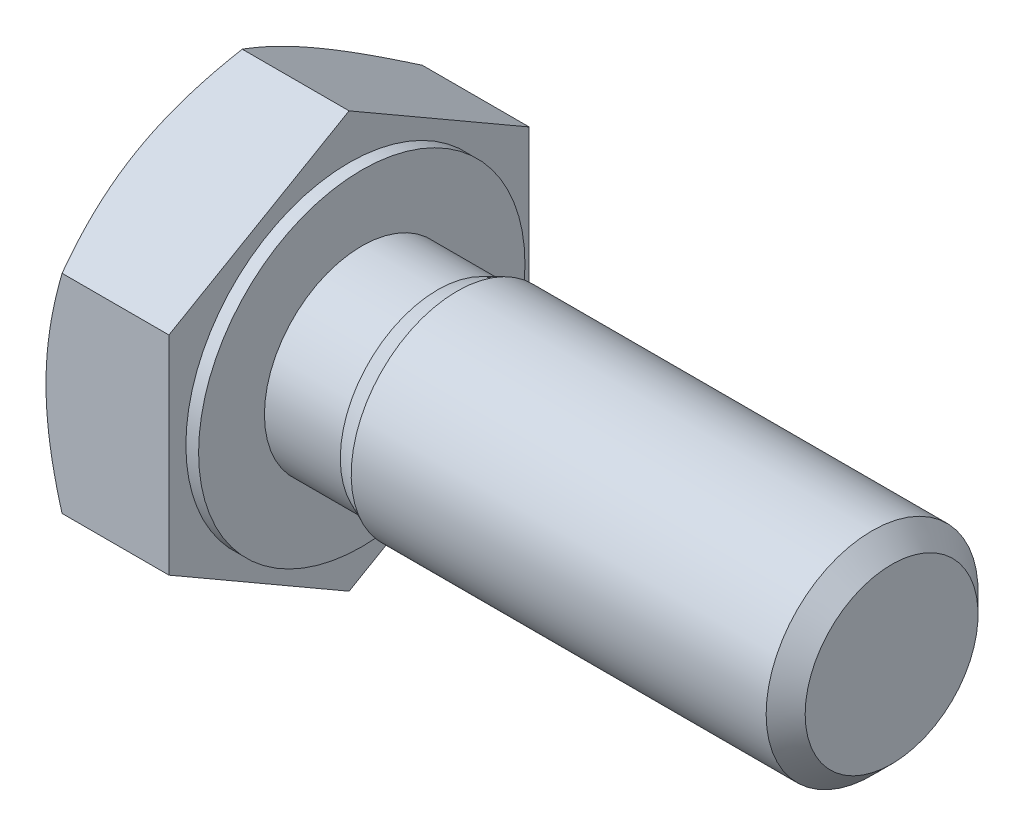
ISO-10303-21;
HEADER;
FILE_DESCRIPTION(('STEP AP214'),'2;1');
FILE_NAME('part.step','',(''),(''),'','','');
FILE_SCHEMA(('AUTOMOTIVE_DESIGN { 1 0 10303 214 1 1 1 1 }'));
ENDSEC;
DATA;
#1=APPLICATION_CONTEXT('core data for automotive mechanical design processes');
#2=APPLICATION_PROTOCOL_DEFINITION('international standard','automotive_design',2000,#1);
#3=PRODUCT_CONTEXT('',#1,'mechanical');
#4=PRODUCT('Part','Part','',(#3));
#5=PRODUCT_RELATED_PRODUCT_CATEGORY('part','',(#4));
#6=PRODUCT_DEFINITION_FORMATION('','',#4);
#7=PRODUCT_DEFINITION_CONTEXT('part definition',#1,'design');
#8=PRODUCT_DEFINITION('design','',#6,#7);
#9=PRODUCT_DEFINITION_SHAPE('','',#8);
#10=(LENGTH_UNIT() NAMED_UNIT(*) SI_UNIT(.MILLI.,.METRE.));
#11=(NAMED_UNIT(*) PLANE_ANGLE_UNIT() SI_UNIT($,.RADIAN.));
#12=(NAMED_UNIT(*) SI_UNIT($,.STERADIAN.) SOLID_ANGLE_UNIT());
#13=UNCERTAINTY_MEASURE_WITH_UNIT(LENGTH_MEASURE(1.E-05),#10,'distance_accuracy_value','');
#14=(GEOMETRIC_REPRESENTATION_CONTEXT(3) GLOBAL_UNCERTAINTY_ASSIGNED_CONTEXT((#13)) GLOBAL_UNIT_ASSIGNED_CONTEXT((#10,
#11,#12)) REPRESENTATION_CONTEXT('',''));
#15=CARTESIAN_POINT('',(0.,0.,0.));
#16=DIRECTION('',(0.,0.,1.));
#17=DIRECTION('',(1.,0.,0.));
#18=AXIS2_PLACEMENT_3D('',#15,#16,#17);
#19=CARTESIAN_POINT('',(-6.40009999999999,0.,0.));
#20=DIRECTION('',(1.,0.,0.));
#21=DIRECTION('',(0.,1.,0.));
#22=AXIS2_PLACEMENT_3D('',#19,#20,#21);
#23=PLANE('',#22);
#24=CARTESIAN_POINT('',(-6.40010000000001,0.,0.));
#25=DIRECTION('',(1.,0.,0.));
#26=DIRECTION('',(0.,0.,-1.));
#27=AXIS2_PLACEMENT_3D('',#24,#25,#26);
#28=CIRCLE('',#27,8.49999999999999);
#29=CARTESIAN_POINT('',(-6.40010000000001,7.36121593216772,-4.24999999999999));
#30=VERTEX_POINT('',#29);
#31=CARTESIAN_POINT('',(-6.40010000000001,7.36121593216772,4.25));
#32=VERTEX_POINT('',#31);
#33=EDGE_CURVE('E372',#30,#32,#28,.T.);
#34=ORIENTED_EDGE('',*,*,#33,.F.);
#35=CARTESIAN_POINT('',(-6.40010000000001,0.,0.));
#36=DIRECTION('',(1.,0.,0.));
#37=DIRECTION('',(0.,0.,-1.));
#38=AXIS2_PLACEMENT_3D('',#35,#36,#37);
#39=CIRCLE('',#38,8.49999999999999);
#40=CARTESIAN_POINT('',(-6.40010000000001,0.,-8.49999999999999));
#41=VERTEX_POINT('',#40);
#42=EDGE_CURVE('E368',#41,#30,#39,.T.);
#43=ORIENTED_EDGE('',*,*,#42,.F.);
#44=CARTESIAN_POINT('',(-6.40010000000001,0.,0.));
#45=DIRECTION('',(1.,0.,0.));
#46=DIRECTION('',(0.,0.,-1.));
#47=AXIS2_PLACEMENT_3D('',#44,#45,#46);
#48=CIRCLE('',#47,8.49999999999999);
#49=CARTESIAN_POINT('',(-6.40010000000001,-7.36121593216772,-4.25));
#50=VERTEX_POINT('',#49);
#51=EDGE_CURVE('E364',#50,#41,#48,.T.);
#52=ORIENTED_EDGE('',*,*,#51,.F.);
#53=CARTESIAN_POINT('',(-6.40010000000001,0.,0.));
#54=DIRECTION('',(1.,0.,0.));
#55=DIRECTION('',(0.,0.,-1.));
#56=AXIS2_PLACEMENT_3D('',#53,#54,#55);
#57=CIRCLE('',#56,8.49999999999999);
#58=CARTESIAN_POINT('',(-6.40010000000001,-7.36121593216773,4.24999999999999));
#59=VERTEX_POINT('',#58);
#60=EDGE_CURVE('E91',#59,#50,#57,.T.);
#61=ORIENTED_EDGE('',*,*,#60,.F.);
#62=CARTESIAN_POINT('',(-6.40010000000001,0.,0.));
#63=DIRECTION('',(1.,0.,0.));
#64=DIRECTION('',(0.,0.,-1.));
#65=AXIS2_PLACEMENT_3D('',#62,#63,#64);
#66=CIRCLE('',#65,8.49999999999999);
#67=CARTESIAN_POINT('',(-6.40010000000001,0.,8.49999999999999));
#68=VERTEX_POINT('',#67);
#69=EDGE_CURVE('E88',#68,#59,#66,.T.);
#70=ORIENTED_EDGE('',*,*,#69,.F.);
#71=CARTESIAN_POINT('',(-6.40010000000001,0.,0.));
#72=DIRECTION('',(1.,0.,0.));
#73=DIRECTION('',(0.,0.,-1.));
#74=AXIS2_PLACEMENT_3D('',#71,#72,#73);
#75=CIRCLE('',#74,8.49999999999999);
#76=EDGE_CURVE('E20',#32,#68,#75,.T.);
#77=ORIENTED_EDGE('',*,*,#76,.F.);
#78=EDGE_LOOP('',(#34,#43,#52,#61,#70,#77));
#79=FACE_BOUND('',#78,.T.);
#80=ADVANCED_FACE('F17',(#79),#23,.F.);
#81=CARTESIAN_POINT('',(-5.63635548517385,0.,0.));
#82=DIRECTION('',(1.,0.,0.));
#83=DIRECTION('',(0.,0.,-1.));
#84=AXIS2_PLACEMENT_3D('',#81,#82,#83);
#85=CONICAL_SURFACE('',#84,9.82284430368096,1.0471975511966);
#86=ORIENTED_EDGE('',*,*,#76,.T.);
#87=CARTESIAN_POINT('',(-5.64091062144517,4.90747728811179,8.5));
#88=CARTESIAN_POINT('',(-5.75625561427077,4.50801072781283,8.5));
#89=CARTESIAN_POINT('',(-5.86193176552784,4.10534509574864,8.5));
#90=CARTESIAN_POINT('',(-6.04828975558869,3.29646437388338,8.5));
#91=CARTESIAN_POINT('',(-6.12909518583168,2.89027749857132,8.5));
#92=CARTESIAN_POINT('',(-6.22831053518057,2.27716376729255,8.5));
#93=CARTESIAN_POINT('',(-6.25772889634085,2.07201802968809,8.5));
#94=CARTESIAN_POINT('',(-6.30865269274857,1.66074443821209,8.5));
#95=CARTESIAN_POINT('',(-6.33015833626476,1.45461661033458,8.5));
#96=CARTESIAN_POINT('',(-6.36487884359466,1.04061639698707,8.5));
#97=CARTESIAN_POINT('',(-6.37805154526193,0.83274044836006,8.5));
#98=CARTESIAN_POINT('',(-6.39568035620301,0.416579726441347,8.5));
#99=CARTESIAN_POINT('',(-6.40013473918327,0.208294880355975,8.5));
#100=CARTESIAN_POINT('',(-6.40010000000001,0.,8.5));
#101=B_SPLINE_CURVE_WITH_KNOTS('',3,(#87,#88,#89,#90,#91,#92,#93,#94,#95,#96,#97,#98,#99,#100),
.UNSPECIFIED.,.F.,.F.,(4,2,2,2,2,2,4),(0.,1.24786231926414,2.48941953510568,3.11101273432829,
3.73258957157481,4.35728675972873,4.98210763017936),.UNSPECIFIED.);
#102=CARTESIAN_POINT('',(-5.64091062144517,4.90747728811179,8.5));
#103=VERTEX_POINT('',#102);
#104=EDGE_CURVE('E109',#103,#68,#101,.T.);
#105=ORIENTED_EDGE('',*,*,#104,.F.);
#106=CARTESIAN_POINT('',(-6.40010000000001,7.36121593216772,4.25));
#107=CARTESIAN_POINT('',(-6.40013473918327,7.25706849198973,4.43038865786652));
#108=CARTESIAN_POINT('',(-6.39568035620302,7.15292606894704,4.61076862579978));
#109=CARTESIAN_POINT('',(-6.37805154526193,6.94484570798768,4.97117438303866));
#110=CARTESIAN_POINT('',(-6.36487884359466,6.84090773367418,5.15120023538544));
#111=CARTESIAN_POINT('',(-6.33015833626476,6.63390762700042,5.50973493731657));
#112=CARTESIAN_POINT('',(-6.30865269274857,6.53084371306166,5.6882468726854));
#113=CARTESIAN_POINT('',(-6.25772889634085,6.32520691732366,6.04442025080929));
#114=CARTESIAN_POINT('',(-6.22831053518057,6.22263404852143,6.22208167105284));
#115=CARTESIAN_POINT('',(-6.12909518583168,5.91607718288204,6.75305373774932));
#116=CARTESIAN_POINT('',(-6.04828975558869,5.71298374522601,7.10482189045339));
#117=CARTESIAN_POINT('',(-5.86193176552784,5.30854338429338,7.80533314422021));
#118=CARTESIAN_POINT('',(-5.75625561427076,5.10721056826128,8.15405181081872));
#119=CARTESIAN_POINT('',(-5.64091062144517,4.9074772881118,8.50000000000001));
#120=B_SPLINE_CURVE_WITH_KNOTS('',3,(#106,#107,#108,#109,#110,#111,#112,#113,#114,#115,#116,
#117,#118,#119),.UNSPECIFIED.,.F.,.F.,(4,2,2,2,2,2,4),(0.,0.624820870450639,1.24951805860457,
1.87109489585109,2.4926880950737,3.73424531091525,4.9821076301794),.UNSPECIFIED.);
#121=EDGE_CURVE('E103',#32,#103,#120,.T.);
#122=ORIENTED_EDGE('',*,*,#121,.F.);
#123=EDGE_LOOP('',(#86,#105,#122));
#124=FACE_BOUND('',#123,.T.);
#125=ADVANCED_FACE('F108',(#124),#85,.T.);
#126=CARTESIAN_POINT('',(-5.63635548517385,0.,0.));
#127=DIRECTION('',(1.,0.,0.));
#128=DIRECTION('',(0.,0.,-1.));
#129=AXIS2_PLACEMENT_3D('',#126,#127,#128);
#130=CONICAL_SURFACE('',#129,9.82284430368095,1.0471975511966);
#131=CARTESIAN_POINT('',(-6.40010000000001,0.,8.5));
#132=CARTESIAN_POINT('',(-6.40013473918327,-0.208294880355988,8.49999999999999));
#133=CARTESIAN_POINT('',(-6.39568035620301,-0.416579726441361,8.49999999999999));
#134=CARTESIAN_POINT('',(-6.37805154526193,-0.832740448360073,8.49999999999999));
#135=CARTESIAN_POINT('',(-6.36487884359466,-1.04061639698708,8.49999999999999));
#136=CARTESIAN_POINT('',(-6.33015833626476,-1.45461661033459,8.49999999999999));
#137=CARTESIAN_POINT('',(-6.30865269274857,-1.66074443821211,8.49999999999999));
#138=CARTESIAN_POINT('',(-6.25772889634085,-2.07201802968811,8.49999999999999));
#139=CARTESIAN_POINT('',(-6.22831053518057,-2.27716376729256,8.49999999999999));
#140=CARTESIAN_POINT('',(-6.12909518583168,-2.89027749857133,8.49999999999999));
#141=CARTESIAN_POINT('',(-6.04828975558869,-3.29646437388339,8.49999999999999));
#142=CARTESIAN_POINT('',(-5.86193176552784,-4.10534509574865,8.49999999999999));
#143=CARTESIAN_POINT('',(-5.75625561427077,-4.50801072781284,8.49999999999999));
#144=CARTESIAN_POINT('',(-5.64091062144517,-4.9074772881118,8.49999999999999));
#145=B_SPLINE_CURVE_WITH_KNOTS('',3,(#131,#132,#133,#134,#135,#136,#137,#138,#139,#140,#141,
#142,#143,#144),.UNSPECIFIED.,.F.,.F.,(4,2,2,2,2,2,4),(0.,0.624820870450634,1.24951805860456,
1.87109489585108,2.49268809507368,3.73424531091522,4.98210763017936),.UNSPECIFIED.);
#146=CARTESIAN_POINT('',(-5.64091062144517,-4.90747728811181,8.5));
#147=VERTEX_POINT('',#146);
#148=EDGE_CURVE('E96',#68,#147,#145,.T.);
#149=ORIENTED_EDGE('',*,*,#148,.F.);
#150=ORIENTED_EDGE('',*,*,#69,.T.);
#151=CARTESIAN_POINT('',(-5.64091062144516,-4.90747728811182,8.5));
#152=CARTESIAN_POINT('',(-5.75625561427076,-5.1072105682613,8.15405181081871));
#153=CARTESIAN_POINT('',(-5.86193176552783,-5.30854338429339,7.8053331442202));
#154=CARTESIAN_POINT('',(-6.04828975558869,-5.71298374522603,7.10482189045339));
#155=CARTESIAN_POINT('',(-6.12909518583168,-5.91607718288206,6.75305373774932));
#156=CARTESIAN_POINT('',(-6.22831053518057,-6.22263404852144,6.22208167105283));
#157=CARTESIAN_POINT('',(-6.25772889634085,-6.32520691732367,6.04442025080928));
#158=CARTESIAN_POINT('',(-6.30865269274857,-6.53084371306167,5.6882468726854));
#159=CARTESIAN_POINT('',(-6.33015833626475,-6.63390762700043,5.50973493731656));
#160=CARTESIAN_POINT('',(-6.36487884359466,-6.84090773367419,5.15120023538544));
#161=CARTESIAN_POINT('',(-6.37805154526193,-6.94484570798769,4.97117438303866));
#162=CARTESIAN_POINT('',(-6.39568035620301,-7.15292606894705,4.61076862579978));
#163=CARTESIAN_POINT('',(-6.40013473918327,-7.25706849198974,4.43038865786651));
#164=CARTESIAN_POINT('',(-6.40010000000001,-7.36121593216773,4.24999999999999));
#165=B_SPLINE_CURVE_WITH_KNOTS('',3,(#151,#152,#153,#154,#155,#156,#157,#158,#159,#160,#161,
#162,#163,#164),.UNSPECIFIED.,.F.,.F.,(4,2,2,2,2,2,4),(0.,1.24786231926415,2.4894195351057,
3.11101273432831,3.73258957157484,4.35728675972876,4.9821076301794),.UNSPECIFIED.);
#166=EDGE_CURVE('E98',#147,#59,#165,.T.);
#167=ORIENTED_EDGE('',*,*,#166,.F.);
#168=EDGE_LOOP('',(#149,#150,#167));
#169=FACE_BOUND('',#168,.T.);
#170=ADVANCED_FACE('F97',(#169),#130,.T.);
#171=CARTESIAN_POINT('',(-5.63635548517385,0.,0.));
#172=DIRECTION('',(1.,0.,0.));
#173=DIRECTION('',(0.,0.,-1.));
#174=AXIS2_PLACEMENT_3D('',#171,#172,#173);
#175=CONICAL_SURFACE('',#174,9.82284430368096,1.0471975511966);
#176=CARTESIAN_POINT('',(-6.40010000000001,-7.36121593216773,4.24999999999999));
#177=CARTESIAN_POINT('',(-6.40013473918327,-7.46536337234572,4.06961134213347));
#178=CARTESIAN_POINT('',(-6.39568035620301,-7.56950579538841,3.88923137420021));
#179=CARTESIAN_POINT('',(-6.37805154526193,-7.77758615634776,3.52882561696133));
#180=CARTESIAN_POINT('',(-6.36487884359466,-7.88152413066127,3.34879976461455));
#181=CARTESIAN_POINT('',(-6.33015833626476,-8.08852423733502,2.99026506268343));
#182=CARTESIAN_POINT('',(-6.30865269274857,-8.19158815127378,2.8117531273146));
#183=CARTESIAN_POINT('',(-6.25772889634085,-8.39722494701178,2.45557974919072));
#184=CARTESIAN_POINT('',(-6.22831053518057,-8.499797815814,2.27791832894716));
#185=CARTESIAN_POINT('',(-6.12909518583168,-8.80635468145339,1.74694626225068));
#186=CARTESIAN_POINT('',(-6.04828975558869,-9.00944811910942,1.39517810954662));
#187=CARTESIAN_POINT('',(-5.86193176552784,-9.41388848004205,0.694666855779806));
#188=CARTESIAN_POINT('',(-5.75625561427076,-9.61522129607414,0.345948189181299));
#189=CARTESIAN_POINT('',(-5.64091062144517,-9.81495457622363,0.));
#190=B_SPLINE_CURVE_WITH_KNOTS('',3,(#176,#177,#178,#179,#180,#181,#182,#183,#184,#185,#186,
#187,#188,#189),.UNSPECIFIED.,.F.,.F.,(4,2,2,2,2,2,4),(0.,0.624820870450635,1.24951805860456,
1.87109489585108,2.49268809507368,3.73424531091522,4.98210763017936),.UNSPECIFIED.);
#191=CARTESIAN_POINT('',(-5.64091062144517,-9.81495457622363,0.));
#192=VERTEX_POINT('',#191);
#193=EDGE_CURVE('E114',#59,#192,#190,.T.);
#194=ORIENTED_EDGE('',*,*,#193,.F.);
#195=ORIENTED_EDGE('',*,*,#60,.T.);
#196=CARTESIAN_POINT('',(-5.64091062144516,-9.81495457622364,0.));
#197=CARTESIAN_POINT('',(-5.75625561427076,-9.61522129607416,-0.345948189181284));
#198=CARTESIAN_POINT('',(-5.86193176552783,-9.41388848004206,-0.694666855779793));
#199=CARTESIAN_POINT('',(-6.04828975558869,-9.00944811910943,-1.39517810954661));
#200=CARTESIAN_POINT('',(-6.12909518583168,-8.8063546814534,-1.74694626225068));
#201=CARTESIAN_POINT('',(-6.22831053518057,-8.49979781581401,-2.27791832894716));
#202=CARTESIAN_POINT('',(-6.25772889634085,-8.39722494701178,-2.45557974919071));
#203=CARTESIAN_POINT('',(-6.30865269274857,-8.19158815127378,-2.8117531273146));
#204=CARTESIAN_POINT('',(-6.33015833626475,-8.08852423733502,-2.99026506268343));
#205=CARTESIAN_POINT('',(-6.36487884359466,-7.88152413066126,-3.34879976461456));
#206=CARTESIAN_POINT('',(-6.37805154526193,-7.77758615634776,-3.52882561696133));
#207=CARTESIAN_POINT('',(-6.39568035620301,-7.5695057953884,-3.88923137420021));
#208=CARTESIAN_POINT('',(-6.40013473918327,-7.46536337234571,-4.06961134213348));
#209=CARTESIAN_POINT('',(-6.40010000000001,-7.36121593216772,-4.25));
#210=B_SPLINE_CURVE_WITH_KNOTS('',3,(#196,#197,#198,#199,#200,#201,#202,#203,#204,#205,#206,
#207,#208,#209),.UNSPECIFIED.,.F.,.F.,(4,2,2,2,2,2,4),(0.,1.24786231926415,2.4894195351057,
3.11101273432831,3.73258957157483,4.35728675972876,4.9821076301794),.UNSPECIFIED.);
#211=EDGE_CURVE('E208',#192,#50,#210,.T.);
#212=ORIENTED_EDGE('',*,*,#211,.F.);
#213=EDGE_LOOP('',(#194,#195,#212));
#214=FACE_BOUND('',#213,.T.);
#215=ADVANCED_FACE('F216',(#214),#175,.T.);
#216=CARTESIAN_POINT('',(-5.63635548517385,0.,0.));
#217=DIRECTION('',(1.,0.,0.));
#218=DIRECTION('',(0.,0.,-1.));
#219=AXIS2_PLACEMENT_3D('',#216,#217,#218);
#220=CONICAL_SURFACE('',#219,9.82284430368096,1.0471975511966);
#221=CARTESIAN_POINT('',(-6.40010000000001,-7.36121593216772,-4.25));
#222=CARTESIAN_POINT('',(-6.40013473918327,-7.25706849198973,-4.43038865786652));
#223=CARTESIAN_POINT('',(-6.39568035620302,-7.15292606894704,-4.61076862579978));
#224=CARTESIAN_POINT('',(-6.37805154526193,-6.94484570798769,-4.97117438303866));
#225=CARTESIAN_POINT('',(-6.36487884359466,-6.84090773367419,-5.15120023538544));
#226=CARTESIAN_POINT('',(-6.33015833626476,-6.63390762700043,-5.50973493731656));
#227=CARTESIAN_POINT('',(-6.30865269274857,-6.53084371306167,-5.68824687268539));
#228=CARTESIAN_POINT('',(-6.25772889634085,-6.32520691732367,-6.04442025080928));
#229=CARTESIAN_POINT('',(-6.22831053518057,-6.22263404852144,-6.22208167105283));
#230=CARTESIAN_POINT('',(-6.12909518583168,-5.91607718288206,-6.75305373774931));
#231=CARTESIAN_POINT('',(-6.04828975558869,-5.71298374522603,-7.10482189045338));
#232=CARTESIAN_POINT('',(-5.86193176552784,-5.3085433842934,-7.80533314422019));
#233=CARTESIAN_POINT('',(-5.75625561427077,-5.1072105682613,-8.15405181081869));
#234=CARTESIAN_POINT('',(-5.64091062144517,-4.90747728811182,-8.49999999999998));
#235=B_SPLINE_CURVE_WITH_KNOTS('',3,(#221,#222,#223,#224,#225,#226,#227,#228,#229,#230,#231,
#232,#233,#234),.UNSPECIFIED.,.F.,.F.,(4,2,2,2,2,2,4),(0.,0.624820870450634,1.24951805860456,
1.87109489585108,2.49268809507368,3.73424531091522,4.98210763017937),.UNSPECIFIED.);
#236=CARTESIAN_POINT('',(-5.64091062144517,-4.90747728811182,-8.49999999999999));
#237=VERTEX_POINT('',#236);
#238=EDGE_CURVE('E220',#50,#237,#235,.T.);
#239=ORIENTED_EDGE('',*,*,#238,.F.);
#240=ORIENTED_EDGE('',*,*,#51,.T.);
#241=CARTESIAN_POINT('',(-5.64091062144516,-4.90747728811182,-8.5));
#242=CARTESIAN_POINT('',(-5.75625561427075,-4.50801072781286,-8.5));
#243=CARTESIAN_POINT('',(-5.86193176552783,-4.10534509574867,-8.5));
#244=CARTESIAN_POINT('',(-6.04828975558869,-3.2964643738834,-8.5));
#245=CARTESIAN_POINT('',(-6.12909518583168,-2.89027749857134,-8.5));
#246=CARTESIAN_POINT('',(-6.22831053518057,-2.27716376729257,-8.5));
#247=CARTESIAN_POINT('',(-6.25772889634084,-2.07201802968811,-8.5));
#248=CARTESIAN_POINT('',(-6.30865269274857,-1.66074443821211,-8.5));
#249=CARTESIAN_POINT('',(-6.33015833626475,-1.4546166103346,-8.5));
#250=CARTESIAN_POINT('',(-6.36487884359466,-1.04061639698708,-8.5));
#251=CARTESIAN_POINT('',(-6.37805154526192,-0.832740448360071,-8.5));
#252=CARTESIAN_POINT('',(-6.39568035620301,-0.416579726441356,-8.5));
#253=CARTESIAN_POINT('',(-6.40013473918327,-0.208294880355983,-8.5));
#254=CARTESIAN_POINT('',(-6.40010000000001,0.,-8.5));
#255=B_SPLINE_CURVE_WITH_KNOTS('',3,(#241,#242,#243,#244,#245,#246,#247,#248,#249,#250,#251,
#252,#253,#254),.UNSPECIFIED.,.F.,.F.,(4,2,2,2,2,2,4),(0.,1.24786231926415,2.4894195351057,
3.11101273432831,3.73258957157483,4.35728675972876,4.9821076301794),.UNSPECIFIED.);
#256=EDGE_CURVE('E202',#237,#41,#255,.T.);
#257=ORIENTED_EDGE('',*,*,#256,.F.);
#258=EDGE_LOOP('',(#239,#240,#257));
#259=FACE_BOUND('',#258,.T.);
#260=ADVANCED_FACE('F213',(#259),#220,.T.);
#261=CARTESIAN_POINT('',(-5.63635548517385,0.,0.));
#262=DIRECTION('',(1.,0.,0.));
#263=DIRECTION('',(0.,0.,-1.));
#264=AXIS2_PLACEMENT_3D('',#261,#262,#263);
#265=CONICAL_SURFACE('',#264,9.82284430368095,1.0471975511966);
#266=ORIENTED_EDGE('',*,*,#42,.T.);
#267=CARTESIAN_POINT('',(-5.64091062144516,4.90747728811181,-8.5));
#268=CARTESIAN_POINT('',(-5.75625561427076,5.1072105682613,-8.15405181081871));
#269=CARTESIAN_POINT('',(-5.86193176552783,5.30854338429339,-7.8053331442202));
#270=CARTESIAN_POINT('',(-6.04828975558869,5.71298374522602,-7.10482189045339));
#271=CARTESIAN_POINT('',(-6.12909518583168,5.91607718288206,-6.75305373774932));
#272=CARTESIAN_POINT('',(-6.22831053518057,6.22263404852144,-6.22208167105283));
#273=CARTESIAN_POINT('',(-6.25772889634085,6.32520691732367,-6.04442025080928));
#274=CARTESIAN_POINT('',(-6.30865269274857,6.53084371306167,-5.6882468726854));
#275=CARTESIAN_POINT('',(-6.33015833626476,6.63390762700043,-5.50973493731656));
#276=CARTESIAN_POINT('',(-6.36487884359466,6.84090773367419,-5.15120023538544));
#277=CARTESIAN_POINT('',(-6.37805154526193,6.94484570798769,-4.97117438303866));
#278=CARTESIAN_POINT('',(-6.39568035620301,7.15292606894705,-4.61076862579978));
#279=CARTESIAN_POINT('',(-6.40013473918327,7.25706849198974,-4.43038865786651));
#280=CARTESIAN_POINT('',(-6.40010000000001,7.36121593216773,-4.24999999999999));
#281=B_SPLINE_CURVE_WITH_KNOTS('',3,(#267,#268,#269,#270,#271,#272,#273,#274,#275,#276,#277,
#278,#279,#280),.UNSPECIFIED.,.F.,.F.,(4,2,2,2,2,2,4),(0.,1.24786231926415,2.4894195351057,
3.11101273432831,3.73258957157483,4.35728675972876,4.9821076301794),.UNSPECIFIED.);
#282=CARTESIAN_POINT('',(-5.64091062144517,4.90747728811181,-8.5));
#283=VERTEX_POINT('',#282);
#284=EDGE_CURVE('E174',#283,#30,#281,.T.);
#285=ORIENTED_EDGE('',*,*,#284,.F.);
#286=CARTESIAN_POINT('',(-6.40010000000001,0.,-8.5));
#287=CARTESIAN_POINT('',(-6.40013473918327,0.208294880355983,-8.5));
#288=CARTESIAN_POINT('',(-6.39568035620301,0.416579726441355,-8.5));
#289=CARTESIAN_POINT('',(-6.37805154526192,0.832740448360068,-8.5));
#290=CARTESIAN_POINT('',(-6.36487884359466,1.04061639698707,-8.5));
#291=CARTESIAN_POINT('',(-6.33015833626475,1.45461661033459,-8.5));
#292=CARTESIAN_POINT('',(-6.30865269274857,1.6607444382121,-8.5));
#293=CARTESIAN_POINT('',(-6.25772889634085,2.0720180296881,-8.5));
#294=CARTESIAN_POINT('',(-6.22831053518057,2.27716376729256,-8.5));
#295=CARTESIAN_POINT('',(-6.12909518583168,2.89027749857133,-8.5));
#296=CARTESIAN_POINT('',(-6.04828975558869,3.29646437388339,-8.5));
#297=CARTESIAN_POINT('',(-5.86193176552784,4.10534509574865,-8.5));
#298=CARTESIAN_POINT('',(-5.75625561427076,4.50801072781284,-8.49999999999999));
#299=CARTESIAN_POINT('',(-5.64091062144517,4.9074772881118,-8.5));
#300=B_SPLINE_CURVE_WITH_KNOTS('',3,(#286,#287,#288,#289,#290,#291,#292,#293,#294,#295,#296,
#297,#298,#299),.UNSPECIFIED.,.F.,.F.,(4,2,2,2,2,2,4),(0.,0.624820870450635,1.24951805860456,
1.87109489585108,2.49268809507368,3.73424531091522,4.98210763017937),.UNSPECIFIED.);
#301=EDGE_CURVE('E197',#41,#283,#300,.T.);
#302=ORIENTED_EDGE('',*,*,#301,.F.);
#303=EDGE_LOOP('',(#266,#285,#302));
#304=FACE_BOUND('',#303,.T.);
#305=ADVANCED_FACE('F159',(#304),#265,.T.);
#306=CARTESIAN_POINT('',(-5.63635548517385,0.,0.));
#307=DIRECTION('',(1.,0.,0.));
#308=DIRECTION('',(0.,0.,-1.));
#309=AXIS2_PLACEMENT_3D('',#306,#307,#308);
#310=CONICAL_SURFACE('',#309,9.82284430368096,1.0471975511966);
#311=ORIENTED_EDGE('',*,*,#33,.T.);
#312=CARTESIAN_POINT('',(-5.64091062144517,9.81495457622363,0.));
#313=CARTESIAN_POINT('',(-5.75625561427076,9.61522129607415,0.345948189181294));
#314=CARTESIAN_POINT('',(-5.86193176552784,9.41388848004206,0.694666855779801));
#315=CARTESIAN_POINT('',(-6.04828975558869,9.00944811910942,1.39517810954661));
#316=CARTESIAN_POINT('',(-6.12909518583168,8.80635468145339,1.74694626225068));
#317=CARTESIAN_POINT('',(-6.22831053518057,8.499797815814,2.27791832894716));
#318=CARTESIAN_POINT('',(-6.25772889634085,8.39722494701178,2.45557974919072));
#319=CARTESIAN_POINT('',(-6.30865269274857,8.19158815127378,2.8117531273146));
#320=CARTESIAN_POINT('',(-6.33015833626476,8.08852423733502,2.99026506268343));
#321=CARTESIAN_POINT('',(-6.36487884359466,7.88152413066126,3.34879976461456));
#322=CARTESIAN_POINT('',(-6.37805154526193,7.77758615634776,3.52882561696134));
#323=CARTESIAN_POINT('',(-6.39568035620301,7.5695057953884,3.88923137420021));
#324=CARTESIAN_POINT('',(-6.40013473918327,7.46536337234571,4.06961134213348));
#325=CARTESIAN_POINT('',(-6.40010000000001,7.36121593216772,4.25));
#326=B_SPLINE_CURVE_WITH_KNOTS('',3,(#312,#313,#314,#315,#316,#317,#318,#319,#320,#321,#322,
#323,#324,#325),.UNSPECIFIED.,.F.,.F.,(4,2,2,2,2,2,4),(0.,1.24786231926415,2.48941953510569,
3.1110127343283,3.73258957157482,4.35728675972875,4.98210763017939),.UNSPECIFIED.);
#327=CARTESIAN_POINT('',(-5.64091062144517,9.81495457622363,0.));
#328=VERTEX_POINT('',#327);
#329=EDGE_CURVE('E144',#328,#32,#326,.T.);
#330=ORIENTED_EDGE('',*,*,#329,.F.);
#331=CARTESIAN_POINT('',(-6.40010000000001,7.36121593216773,-4.24999999999999));
#332=CARTESIAN_POINT('',(-6.40013473918327,7.46536337234572,-4.06961134213347));
#333=CARTESIAN_POINT('',(-6.39568035620302,7.5695057953884,-3.88923137420021));
#334=CARTESIAN_POINT('',(-6.37805154526193,7.77758615634776,-3.52882561696133));
#335=CARTESIAN_POINT('',(-6.36487884359466,7.88152413066127,-3.34879976461455));
#336=CARTESIAN_POINT('',(-6.33015833626476,8.08852423733502,-2.99026506268343));
#337=CARTESIAN_POINT('',(-6.30865269274857,8.19158815127378,-2.81175312731459));
#338=CARTESIAN_POINT('',(-6.25772889634085,8.39722494701178,-2.45557974919071));
#339=CARTESIAN_POINT('',(-6.22831053518057,8.499797815814,-2.27791832894716));
#340=CARTESIAN_POINT('',(-6.12909518583168,8.80635468145339,-1.74694626225068));
#341=CARTESIAN_POINT('',(-6.04828975558869,9.00944811910942,-1.39517810954661));
#342=CARTESIAN_POINT('',(-5.86193176552784,9.41388848004206,-0.694666855779796));
#343=CARTESIAN_POINT('',(-5.75625561427076,9.61522129607415,-0.345948189181289));
#344=CARTESIAN_POINT('',(-5.64091062144517,9.81495457622363,0.));
#345=B_SPLINE_CURVE_WITH_KNOTS('',3,(#331,#332,#333,#334,#335,#336,#337,#338,#339,#340,#341,
#342,#343,#344),.UNSPECIFIED.,.F.,.F.,(4,2,2,2,2,2,4),(0.,0.624820870450637,1.24951805860456,
1.87109489585108,2.49268809507369,3.73424531091523,4.98210763017938),.UNSPECIFIED.);
#346=EDGE_CURVE('E165',#30,#328,#345,.T.);
#347=ORIENTED_EDGE('',*,*,#346,.F.);
#348=EDGE_LOOP('',(#311,#330,#347));
#349=FACE_BOUND('',#348,.T.);
#350=ADVANCED_FACE('F153',(#349),#310,.T.);
#351=CARTESIAN_POINT('',(-0.600099999999995,9.81495457622363,0.));
#352=DIRECTION('',(0.,0.866025403784438,0.500000000000001));
#353=DIRECTION('',(0.,-0.500000000000001,0.866025403784438));
#354=AXIS2_PLACEMENT_3D('',#351,#352,#353);
#355=PLANE('',#354);
#356=DIRECTION('',(0.,-0.500000000000001,0.866025403784438));
#357=VECTOR('',#356,1.);
#358=CARTESIAN_POINT('',(-0.600099999999995,9.81495457622363,0.));
#359=LINE('',#358,#357);
#360=CARTESIAN_POINT('',(-0.600099999999995,9.81495457622363,0.));
#361=VERTEX_POINT('',#360);
#362=CARTESIAN_POINT('',(-0.600099999999994,4.90747728811181,8.5));
#363=VERTEX_POINT('',#362);
#364=EDGE_CURVE('E296',#361,#363,#359,.T.);
#365=ORIENTED_EDGE('',*,*,#364,.F.);
#366=DIRECTION('',(1.,0.,0.));
#367=VECTOR('',#366,1.);
#368=CARTESIAN_POINT('',(-0.600099999999995,9.81495457622363,0.));
#369=LINE('',#368,#367);
#370=EDGE_CURVE('E173',#328,#361,#369,.T.);
#371=ORIENTED_EDGE('',*,*,#370,.F.);
#372=ORIENTED_EDGE('',*,*,#329,.T.);
#373=ORIENTED_EDGE('',*,*,#121,.T.);
#374=DIRECTION('',(1.,0.,0.));
#375=VECTOR('',#374,1.);
#376=CARTESIAN_POINT('',(-0.600099999999995,4.90747728811181,8.5));
#377=LINE('',#376,#375);
#378=EDGE_CURVE('E102',#363,#103,#377,.F.);
#379=ORIENTED_EDGE('',*,*,#378,.F.);
#380=EDGE_LOOP('',(#365,#371,#372,#373,#379));
#381=FACE_BOUND('',#380,.T.);
#382=ADVANCED_FACE('F150',(#381),#355,.T.);
#383=CARTESIAN_POINT('',(-0.600099999999995,4.90747728811181,8.5));
#384=DIRECTION('',(0.,0.,1.));
#385=DIRECTION('',(0.,-1.,0.));
#386=AXIS2_PLACEMENT_3D('',#383,#384,#385);
#387=PLANE('',#386);
#388=ORIENTED_EDGE('',*,*,#378,.T.);
#389=ORIENTED_EDGE('',*,*,#104,.T.);
#390=ORIENTED_EDGE('',*,*,#148,.T.);
#391=DIRECTION('',(1.,0.,0.));
#392=VECTOR('',#391,1.);
#393=CARTESIAN_POINT('',(-0.600099999999993,-4.90747728811182,8.49999999999999));
#394=LINE('',#393,#392);
#395=CARTESIAN_POINT('',(-0.600099999999993,-4.90747728811182,8.49999999999999));
#396=VERTEX_POINT('',#395);
#397=EDGE_CURVE('E116',#396,#147,#394,.F.);
#398=ORIENTED_EDGE('',*,*,#397,.F.);
#399=DIRECTION('',(0.,1.,0.));
#400=VECTOR('',#399,1.);
#401=CARTESIAN_POINT('',(-0.600099999999994,0.,8.5));
#402=LINE('',#401,#400);
#403=EDGE_CURVE('E292',#363,#396,#402,.F.);
#404=ORIENTED_EDGE('',*,*,#403,.F.);
#405=EDGE_LOOP('',(#388,#389,#390,#398,#404));
#406=FACE_BOUND('',#405,.T.);
#407=ADVANCED_FACE('F112',(#406),#387,.T.);
#408=CARTESIAN_POINT('',(-0.600099999999993,-4.90747728811182,8.49999999999999));
#409=DIRECTION('',(0.,-0.866025403784439,0.5));
#410=DIRECTION('',(0.,-0.5,-0.866025403784439));
#411=AXIS2_PLACEMENT_3D('',#408,#409,#410);
#412=PLANE('',#411);
#413=ORIENTED_EDGE('',*,*,#397,.T.);
#414=ORIENTED_EDGE('',*,*,#166,.T.);
#415=ORIENTED_EDGE('',*,*,#193,.T.);
#416=DIRECTION('',(1.,0.,0.));
#417=VECTOR('',#416,1.);
#418=CARTESIAN_POINT('',(-0.600099999999993,-9.81495457622363,0.));
#419=LINE('',#418,#417);
#420=CARTESIAN_POINT('',(-0.600099999999993,-9.81495457622363,0.));
#421=VERTEX_POINT('',#420);
#422=EDGE_CURVE('E225',#421,#192,#419,.F.);
#423=ORIENTED_EDGE('',*,*,#422,.F.);
#424=DIRECTION('',(0.,-0.499999999999999,-0.866025403784439));
#425=VECTOR('',#424,1.);
#426=CARTESIAN_POINT('',(-0.600099999999993,-4.90747728811182,8.49999999999999));
#427=LINE('',#426,#425);
#428=EDGE_CURVE('E295',#396,#421,#427,.T.);
#429=ORIENTED_EDGE('',*,*,#428,.F.);
#430=EDGE_LOOP('',(#413,#414,#415,#423,#429));
#431=FACE_BOUND('',#430,.T.);
#432=ADVANCED_FACE('F229',(#431),#412,.T.);
#433=CARTESIAN_POINT('',(-0.600099999999993,-9.81495457622363,0.));
#434=DIRECTION('',(0.,-0.866025403784438,-0.5));
#435=DIRECTION('',(0.,0.5,-0.866025403784438));
#436=AXIS2_PLACEMENT_3D('',#433,#434,#435);
#437=PLANE('',#436);
#438=ORIENTED_EDGE('',*,*,#422,.T.);
#439=ORIENTED_EDGE('',*,*,#211,.T.);
#440=ORIENTED_EDGE('',*,*,#238,.T.);
#441=DIRECTION('',(1.,0.,0.));
#442=VECTOR('',#441,1.);
#443=CARTESIAN_POINT('',(-0.600099999999993,-4.90747728811181,-8.5));
#444=LINE('',#443,#442);
#445=CARTESIAN_POINT('',(-0.600099999999994,-4.90747728811181,-8.5));
#446=VERTEX_POINT('',#445);
#447=EDGE_CURVE('E330',#446,#237,#444,.F.);
#448=ORIENTED_EDGE('',*,*,#447,.F.);
#449=DIRECTION('',(0.,0.5,-0.866025403784438));
#450=VECTOR('',#449,1.);
#451=CARTESIAN_POINT('',(-0.600099999999993,-9.81495457622363,0.));
#452=LINE('',#451,#450);
#453=EDGE_CURVE('E301',#421,#446,#452,.T.);
#454=ORIENTED_EDGE('',*,*,#453,.F.);
#455=EDGE_LOOP('',(#438,#439,#440,#448,#454));
#456=FACE_BOUND('',#455,.T.);
#457=ADVANCED_FACE('F194',(#456),#437,.T.);
#458=CARTESIAN_POINT('',(-0.600099999999993,-4.90747728811181,-8.5));
#459=DIRECTION('',(0.,0.,-1.));
#460=DIRECTION('',(0.,1.,0.));
#461=AXIS2_PLACEMENT_3D('',#458,#459,#460);
#462=PLANE('',#461);
#463=DIRECTION('',(0.,1.,0.));
#464=VECTOR('',#463,1.);
#465=CARTESIAN_POINT('',(-0.600099999999994,0.,-8.5));
#466=LINE('',#465,#464);
#467=CARTESIAN_POINT('',(-0.600099999999995,4.90747728811182,-8.49999999999999));
#468=VERTEX_POINT('',#467);
#469=EDGE_CURVE('E306',#446,#468,#466,.T.);
#470=ORIENTED_EDGE('',*,*,#469,.F.);
#471=ORIENTED_EDGE('',*,*,#447,.T.);
#472=ORIENTED_EDGE('',*,*,#256,.T.);
#473=ORIENTED_EDGE('',*,*,#301,.T.);
#474=DIRECTION('',(1.,0.,0.));
#475=VECTOR('',#474,1.);
#476=CARTESIAN_POINT('',(-0.600099999999995,4.90747728811182,-8.49999999999999));
#477=LINE('',#476,#475);
#478=EDGE_CURVE('E35',#468,#283,#477,.F.);
#479=ORIENTED_EDGE('',*,*,#478,.F.);
#480=EDGE_LOOP('',(#470,#471,#472,#473,#479));
#481=FACE_BOUND('',#480,.T.);
#482=ADVANCED_FACE('F187',(#481),#462,.T.);
#483=CARTESIAN_POINT('',(-0.600099999999995,4.90747728811182,-8.49999999999999));
#484=DIRECTION('',(0.,0.866025403784439,-0.5));
#485=DIRECTION('',(0.,0.5,0.866025403784439));
#486=AXIS2_PLACEMENT_3D('',#483,#484,#485);
#487=PLANE('',#486);
#488=DIRECTION('',(0.,0.499999999999999,0.866025403784439));
#489=VECTOR('',#488,1.);
#490=CARTESIAN_POINT('',(-0.600099999999995,4.90747728811182,-8.49999999999999));
#491=LINE('',#490,#489);
#492=EDGE_CURVE('E285',#468,#361,#491,.T.);
#493=ORIENTED_EDGE('',*,*,#492,.F.);
#494=ORIENTED_EDGE('',*,*,#478,.T.);
#495=ORIENTED_EDGE('',*,*,#284,.T.);
#496=ORIENTED_EDGE('',*,*,#346,.T.);
#497=ORIENTED_EDGE('',*,*,#370,.T.);
#498=EDGE_LOOP('',(#493,#494,#495,#496,#497));
#499=FACE_BOUND('',#498,.T.);
#500=ADVANCED_FACE('F181',(#499),#487,.T.);
#501=CARTESIAN_POINT('',(-0.600099999999994,0.,0.));
#502=DIRECTION('',(1.,0.,0.));
#503=DIRECTION('',(0.,1.,0.));
#504=AXIS2_PLACEMENT_3D('',#501,#502,#503);
#505=PLANE('',#504);
#506=CARTESIAN_POINT('',(-0.600099999999995,0.,0.));
#507=DIRECTION('',(1.,0.,0.));
#508=DIRECTION('',(0.,1.,0.));
#509=AXIS2_PLACEMENT_3D('',#506,#507,#508);
#510=CIRCLE('',#509,7.7);
#511=CARTESIAN_POINT('',(-0.600099999999996,7.7,0.));
#512=VERTEX_POINT('',#511);
#513=EDGE_CURVE('E175',#512,#512,#510,.T.);
#514=ORIENTED_EDGE('',*,*,#513,.F.);
#515=EDGE_LOOP('',(#514));
#516=FACE_BOUND('',#515,.T.);
#517=ORIENTED_EDGE('',*,*,#469,.T.);
#518=ORIENTED_EDGE('',*,*,#492,.T.);
#519=ORIENTED_EDGE('',*,*,#364,.T.);
#520=ORIENTED_EDGE('',*,*,#403,.T.);
#521=ORIENTED_EDGE('',*,*,#428,.T.);
#522=ORIENTED_EDGE('',*,*,#453,.T.);
#523=EDGE_LOOP('',(#517,#518,#519,#520,#521,#522));
#524=FACE_BOUND('',#523,.T.);
#525=ADVANCED_FACE('F186',(#516,#524),#505,.T.);
#526=CARTESIAN_POINT('',(-0.300049999999996,0.,0.));
#527=DIRECTION('',(1.,0.,0.));
#528=DIRECTION('',(0.,1.,0.));
#529=AXIS2_PLACEMENT_3D('',#526,#527,#528);
#530=CYLINDRICAL_SURFACE('',#529,7.7);
#531=ORIENTED_EDGE('',*,*,#513,.T.);
#532=EDGE_LOOP('',(#531));
#533=FACE_BOUND('',#532,.T.);
#534=CARTESIAN_POINT('',(0.,0.,0.));
#535=DIRECTION('',(1.,0.,0.));
#536=DIRECTION('',(0.,1.,0.));
#537=AXIS2_PLACEMENT_3D('',#534,#535,#536);
#538=CIRCLE('',#537,7.7);
#539=CARTESIAN_POINT('',(0.,7.7,0.));
#540=VERTEX_POINT('',#539);
#541=EDGE_CURVE('E279',#540,#540,#538,.T.);
#542=ORIENTED_EDGE('',*,*,#541,.F.);
#543=EDGE_LOOP('',(#542));
#544=FACE_BOUND('',#543,.T.);
#545=ADVANCED_FACE('F266',(#533,#544),#530,.T.);
#546=CARTESIAN_POINT('',(0.,6.14702525,0.));
#547=DIRECTION('',(1.,0.,0.));
#548=DIRECTION('',(0.,1.,0.));
#549=AXIS2_PLACEMENT_3D('',#546,#547,#548);
#550=PLANE('',#549);
#551=CARTESIAN_POINT('',(0.,0.,0.));
#552=DIRECTION('',(1.,0.,0.));
#553=DIRECTION('',(0.,1.,0.));
#554=AXIS2_PLACEMENT_3D('',#551,#552,#553);
#555=CIRCLE('',#554,4.5940505);
#556=CARTESIAN_POINT('',(0.,4.5940505,0.));
#557=VERTEX_POINT('',#556);
#558=EDGE_CURVE('E281',#557,#557,#555,.T.);
#559=ORIENTED_EDGE('',*,*,#558,.F.);
#560=EDGE_LOOP('',(#559));
#561=FACE_BOUND('',#560,.T.);
#562=ORIENTED_EDGE('',*,*,#541,.T.);
#563=EDGE_LOOP('',(#562));
#564=FACE_BOUND('',#563,.T.);
#565=ADVANCED_FACE('F263',(#561,#564),#550,.T.);
#566=CARTESIAN_POINT('',(25.,2.5,0.));
#567=DIRECTION('',(1.,0.,0.));
#568=DIRECTION('',(0.,1.,0.));
#569=AXIS2_PLACEMENT_3D('',#566,#567,#568);
#570=PLANE('',#569);
#571=CARTESIAN_POINT('',(24.9999999999773,0.,0.));
#572=DIRECTION('',(-1.,0.,0.));
#573=DIRECTION('',(0.,0.,1.));
#574=AXIS2_PLACEMENT_3D('',#571,#572,#573);
#575=CIRCLE('',#574,4.07982499996252);
#576=CARTESIAN_POINT('',(24.9999999999773,0.,4.07982499996252));
#577=VERTEX_POINT('',#576);
#578=EDGE_CURVE('E283',#577,#577,#575,.T.);
#579=ORIENTED_EDGE('',*,*,#578,.F.);
#580=EDGE_LOOP('',(#579));
#581=FACE_BOUND('',#580,.T.);
#582=ADVANCED_FACE('F259',(#581),#570,.T.);
#583=CARTESIAN_POINT('',(1.7898625,0.,0.));
#584=DIRECTION('',(1.,0.,0.));
#585=DIRECTION('',(0.,1.,0.));
#586=AXIS2_PLACEMENT_3D('',#583,#584,#585);
#587=CYLINDRICAL_SURFACE('',#586,4.5940505);
#588=ORIENTED_EDGE('',*,*,#558,.T.);
#589=EDGE_LOOP('',(#588));
#590=FACE_BOUND('',#589,.T.);
#591=CARTESIAN_POINT('',(3.57972500000869,0.,0.));
#592=DIRECTION('',(1.,0.,0.));
#593=DIRECTION('',(0.,1.,0.));
#594=AXIS2_PLACEMENT_3D('',#591,#592,#593);
#595=CIRCLE('',#594,4.59405049997486);
#596=CARTESIAN_POINT('',(3.57972500000869,4.59405049997486,0.));
#597=VERTEX_POINT('',#596);
#598=EDGE_CURVE('E289',#597,#597,#595,.T.);
#599=ORIENTED_EDGE('',*,*,#598,.F.);
#600=EDGE_LOOP('',(#599));
#601=FACE_BOUND('',#600,.T.);
#602=ADVANCED_FACE('F255',(#590,#601),#587,.T.);
#603=CARTESIAN_POINT('',(24.0797249999218,0.,0.));
#604=DIRECTION('',(-1.,0.,0.));
#605=DIRECTION('',(0.,0.,1.));
#606=AXIS2_PLACEMENT_3D('',#603,#604,#605);
#607=CONICAL_SURFACE('',#606,5.0000000000523,0.785343828878419);
#608=CARTESIAN_POINT('',(24.079725,0.,0.));
#609=DIRECTION('',(1.,0.,0.));
#610=DIRECTION('',(0.,1.,0.));
#611=AXIS2_PLACEMENT_3D('',#608,#609,#610);
#612=CIRCLE('',#611,5.);
#613=CARTESIAN_POINT('',(24.079725,5.,0.));
#614=VERTEX_POINT('',#613);
#615=EDGE_CURVE('E26',#614,#614,#612,.F.);
#616=ORIENTED_EDGE('',*,*,#615,.F.);
#617=EDGE_LOOP('',(#616));
#618=FACE_BOUND('',#617,.T.);
#619=ORIENTED_EDGE('',*,*,#578,.T.);
#620=EDGE_LOOP('',(#619));
#621=FACE_BOUND('',#620,.T.);
#622=ADVANCED_FACE('F248',(#618,#621),#607,.T.);
#623=CARTESIAN_POINT('',(4.50000000006412,0.,0.));
#624=DIRECTION('',(1.,0.,0.));
#625=DIRECTION('',(0.,1.,0.));
#626=AXIS2_PLACEMENT_3D('',#623,#624,#625);
#627=CONICAL_SURFACE('',#626,4.99999999999545,0.41544281639326);
#628=ORIENTED_EDGE('',*,*,#598,.T.);
#629=EDGE_LOOP('',(#628));
#630=FACE_BOUND('',#629,.T.);
#631=CARTESIAN_POINT('',(4.5,0.,0.));
#632=DIRECTION('',(1.,0.,0.));
#633=DIRECTION('',(0.,1.,0.));
#634=AXIS2_PLACEMENT_3D('',#631,#632,#633);
#635=CIRCLE('',#634,5.);
#636=CARTESIAN_POINT('',(4.5,5.,0.));
#637=VERTEX_POINT('',#636);
#638=EDGE_CURVE('E11',#637,#637,#635,.T.);
#639=ORIENTED_EDGE('',*,*,#638,.F.);
#640=EDGE_LOOP('',(#639));
#641=FACE_BOUND('',#640,.T.);
#642=ADVANCED_FACE('F242',(#630,#641),#627,.T.);
#643=CARTESIAN_POINT('',(14.75,0.,0.));
#644=DIRECTION('',(1.,0.,0.));
#645=DIRECTION('',(0.,1.,0.));
#646=AXIS2_PLACEMENT_3D('',#643,#644,#645);
#647=CYLINDRICAL_SURFACE('',#646,5.);
#648=ORIENTED_EDGE('',*,*,#638,.T.);
#649=EDGE_LOOP('',(#648));
#650=FACE_BOUND('',#649,.T.);
#651=ORIENTED_EDGE('',*,*,#615,.T.);
#652=EDGE_LOOP('',(#651));
#653=FACE_BOUND('',#652,.T.);
#654=ADVANCED_FACE('F240',(#650,#653),#647,.T.);
#655=CLOSED_SHELL('',(#80,#125,#170,#215,#260,#305,#350,#382,#407,#432,#457,#482,#500,#525,#545,
#565,#582,#602,#622,#642,#654));
#656=MANIFOLD_SOLID_BREP('B1',#655);
#657=ADVANCED_BREP_SHAPE_REPRESENTATION('',(#18,#656),#14);
#658=SHAPE_DEFINITION_REPRESENTATION(#9,#657);
ENDSEC;
END-ISO-10303-21;
